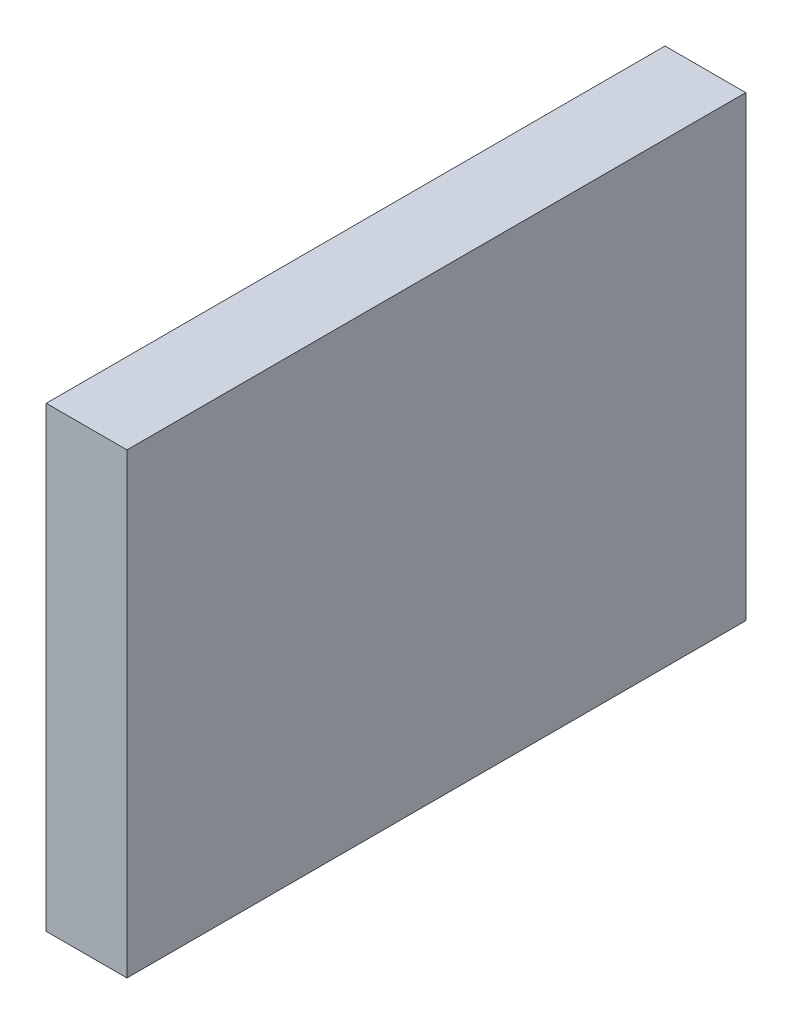
ISO-10303-21;
HEADER;
FILE_DESCRIPTION(('STEP AP214'),'2;1');
FILE_NAME('part.step','',(''),(''),'','','');
FILE_SCHEMA(('AUTOMOTIVE_DESIGN { 1 0 10303 214 1 1 1 1 }'));
ENDSEC;
DATA;
#1=APPLICATION_CONTEXT('core data for automotive mechanical design processes');
#2=APPLICATION_PROTOCOL_DEFINITION('international standard','automotive_design',2000,#1);
#3=PRODUCT_CONTEXT('',#1,'mechanical');
#4=PRODUCT('Part','Part','',(#3));
#5=PRODUCT_RELATED_PRODUCT_CATEGORY('part','',(#4));
#6=PRODUCT_DEFINITION_FORMATION('','',#4);
#7=PRODUCT_DEFINITION_CONTEXT('part definition',#1,'design');
#8=PRODUCT_DEFINITION('design','',#6,#7);
#9=PRODUCT_DEFINITION_SHAPE('','',#8);
#10=(LENGTH_UNIT() NAMED_UNIT(*) SI_UNIT(.MILLI.,.METRE.));
#11=(NAMED_UNIT(*) PLANE_ANGLE_UNIT() SI_UNIT($,.RADIAN.));
#12=(NAMED_UNIT(*) SI_UNIT($,.STERADIAN.) SOLID_ANGLE_UNIT());
#13=UNCERTAINTY_MEASURE_WITH_UNIT(LENGTH_MEASURE(1.E-05),#10,'distance_accuracy_value','');
#14=(GEOMETRIC_REPRESENTATION_CONTEXT(3) GLOBAL_UNCERTAINTY_ASSIGNED_CONTEXT((#13)) GLOBAL_UNIT_ASSIGNED_CONTEXT((#10,
#11,#12)) REPRESENTATION_CONTEXT('',''));
#15=CARTESIAN_POINT('',(0.,0.,0.));
#16=DIRECTION('',(0.,0.,1.));
#17=DIRECTION('',(1.,0.,0.));
#18=AXIS2_PLACEMENT_3D('',#15,#16,#17);
#19=CARTESIAN_POINT('',(-38.1,-215.9,584.2));
#20=DIRECTION('',(1.,0.,0.));
#21=DIRECTION('',(0.,0.,-1.));
#22=AXIS2_PLACEMENT_3D('',#19,#20,#21);
#23=PLANE('',#22);
#24=DIRECTION('',(0.,-1.,0.));
#25=VECTOR('',#24,1.);
#26=CARTESIAN_POINT('',(-38.1,-215.9,0.));
#27=LINE('',#26,#25);
#28=CARTESIAN_POINT('',(-38.1,215.9,0.));
#29=VERTEX_POINT('',#28);
#30=CARTESIAN_POINT('',(-38.1,-215.9,0.));
#31=VERTEX_POINT('',#30);
#32=EDGE_CURVE('E117',#29,#31,#27,.T.);
#33=ORIENTED_EDGE('',*,*,#32,.T.);
#34=DIRECTION('',(0.,0.,-1.));
#35=VECTOR('',#34,1.);
#36=CARTESIAN_POINT('',(-38.1,-215.9,584.2));
#37=LINE('',#36,#35);
#38=CARTESIAN_POINT('',(-38.1,-215.9,584.2));
#39=VERTEX_POINT('',#38);
#40=EDGE_CURVE('E11',#39,#31,#37,.T.);
#41=ORIENTED_EDGE('',*,*,#40,.F.);
#42=DIRECTION('',(0.,-1.,0.));
#43=VECTOR('',#42,1.);
#44=CARTESIAN_POINT('',(-38.1,-215.9,584.2));
#45=LINE('',#44,#43);
#46=CARTESIAN_POINT('',(-38.1,215.9,584.2));
#47=VERTEX_POINT('',#46);
#48=EDGE_CURVE('E101',#47,#39,#45,.T.);
#49=ORIENTED_EDGE('',*,*,#48,.F.);
#50=DIRECTION('',(0.,0.,-1.));
#51=VECTOR('',#50,1.);
#52=CARTESIAN_POINT('',(-38.1,215.9,584.2));
#53=LINE('',#52,#51);
#54=EDGE_CURVE('E113',#47,#29,#53,.T.);
#55=ORIENTED_EDGE('',*,*,#54,.T.);
#56=EDGE_LOOP('',(#33,#41,#49,#55));
#57=FACE_BOUND('',#56,.T.);
#58=ADVANCED_FACE('F49',(#57),#23,.F.);
#59=CARTESIAN_POINT('',(38.1,-215.9,584.2));
#60=DIRECTION('',(0.,1.,0.));
#61=DIRECTION('',(0.,0.,1.));
#62=AXIS2_PLACEMENT_3D('',#59,#60,#61);
#63=PLANE('',#62);
#64=DIRECTION('',(1.,0.,0.));
#65=VECTOR('',#64,1.);
#66=CARTESIAN_POINT('',(38.1,-215.9,0.));
#67=LINE('',#66,#65);
#68=CARTESIAN_POINT('',(38.1,-215.9,0.));
#69=VERTEX_POINT('',#68);
#70=EDGE_CURVE('E106',#31,#69,#67,.T.);
#71=ORIENTED_EDGE('',*,*,#70,.T.);
#72=DIRECTION('',(0.,0.,-1.));
#73=VECTOR('',#72,1.);
#74=CARTESIAN_POINT('',(38.1,-215.9,584.2));
#75=LINE('',#74,#73);
#76=CARTESIAN_POINT('',(38.1,-215.9,584.2));
#77=VERTEX_POINT('',#76);
#78=EDGE_CURVE('E58',#77,#69,#75,.T.);
#79=ORIENTED_EDGE('',*,*,#78,.F.);
#80=DIRECTION('',(1.,0.,0.));
#81=VECTOR('',#80,1.);
#82=CARTESIAN_POINT('',(38.1,-215.9,584.2));
#83=LINE('',#82,#81);
#84=EDGE_CURVE('E96',#39,#77,#83,.T.);
#85=ORIENTED_EDGE('',*,*,#84,.F.);
#86=ORIENTED_EDGE('',*,*,#40,.T.);
#87=EDGE_LOOP('',(#71,#79,#85,#86));
#88=FACE_BOUND('',#87,.T.);
#89=ADVANCED_FACE('F105',(#88),#63,.F.);
#90=CARTESIAN_POINT('',(38.1,-215.9,584.2));
#91=DIRECTION('',(-1.,0.,0.));
#92=DIRECTION('',(0.,0.,1.));
#93=AXIS2_PLACEMENT_3D('',#90,#91,#92);
#94=PLANE('',#93);
#95=DIRECTION('',(0.,1.,0.));
#96=VECTOR('',#95,1.);
#97=CARTESIAN_POINT('',(38.1,-215.9,0.));
#98=LINE('',#97,#96);
#99=CARTESIAN_POINT('',(38.1,215.9,0.));
#100=VERTEX_POINT('',#99);
#101=EDGE_CURVE('E83',#69,#100,#98,.T.);
#102=ORIENTED_EDGE('',*,*,#101,.T.);
#103=DIRECTION('',(0.,0.,-1.));
#104=VECTOR('',#103,1.);
#105=CARTESIAN_POINT('',(38.1,215.9,584.2));
#106=LINE('',#105,#104);
#107=CARTESIAN_POINT('',(38.1,215.9,584.2));
#108=VERTEX_POINT('',#107);
#109=EDGE_CURVE('E108',#108,#100,#106,.T.);
#110=ORIENTED_EDGE('',*,*,#109,.F.);
#111=DIRECTION('',(0.,1.,0.));
#112=VECTOR('',#111,1.);
#113=CARTESIAN_POINT('',(38.1,-215.9,584.2));
#114=LINE('',#113,#112);
#115=EDGE_CURVE('E99',#77,#108,#114,.T.);
#116=ORIENTED_EDGE('',*,*,#115,.F.);
#117=ORIENTED_EDGE('',*,*,#78,.T.);
#118=EDGE_LOOP('',(#102,#110,#116,#117));
#119=FACE_BOUND('',#118,.T.);
#120=ADVANCED_FACE('F109',(#119),#94,.F.);
#121=CARTESIAN_POINT('',(38.1,215.9,584.2));
#122=DIRECTION('',(0.,-1.,0.));
#123=DIRECTION('',(0.,0.,-1.));
#124=AXIS2_PLACEMENT_3D('',#121,#122,#123);
#125=PLANE('',#124);
#126=DIRECTION('',(-1.,0.,0.));
#127=VECTOR('',#126,1.);
#128=CARTESIAN_POINT('',(38.1,215.9,0.));
#129=LINE('',#128,#127);
#130=EDGE_CURVE('E89',#100,#29,#129,.T.);
#131=ORIENTED_EDGE('',*,*,#130,.T.);
#132=ORIENTED_EDGE('',*,*,#54,.F.);
#133=DIRECTION('',(-1.,0.,0.));
#134=VECTOR('',#133,1.);
#135=CARTESIAN_POINT('',(38.1,215.9,584.2));
#136=LINE('',#135,#134);
#137=EDGE_CURVE('E66',#108,#47,#136,.T.);
#138=ORIENTED_EDGE('',*,*,#137,.F.);
#139=ORIENTED_EDGE('',*,*,#109,.T.);
#140=EDGE_LOOP('',(#131,#132,#138,#139));
#141=FACE_BOUND('',#140,.T.);
#142=ADVANCED_FACE('F130',(#141),#125,.F.);
#143=CARTESIAN_POINT('',(0.,0.,584.2));
#144=DIRECTION('',(0.,0.,1.));
#145=DIRECTION('',(1.,0.,0.));
#146=AXIS2_PLACEMENT_3D('',#143,#144,#145);
#147=PLANE('',#146);
#148=ORIENTED_EDGE('',*,*,#48,.T.);
#149=ORIENTED_EDGE('',*,*,#84,.T.);
#150=ORIENTED_EDGE('',*,*,#115,.T.);
#151=ORIENTED_EDGE('',*,*,#137,.T.);
#152=EDGE_LOOP('',(#148,#149,#150,#151));
#153=FACE_BOUND('',#152,.T.);
#154=ADVANCED_FACE('F97',(#153),#147,.T.);
#155=CARTESIAN_POINT('',(0.,0.,0.));
#156=DIRECTION('',(0.,0.,1.));
#157=DIRECTION('',(1.,0.,0.));
#158=AXIS2_PLACEMENT_3D('',#155,#156,#157);
#159=PLANE('',#158);
#160=ORIENTED_EDGE('',*,*,#32,.F.);
#161=ORIENTED_EDGE('',*,*,#130,.F.);
#162=ORIENTED_EDGE('',*,*,#101,.F.);
#163=ORIENTED_EDGE('',*,*,#70,.F.);
#164=EDGE_LOOP('',(#160,#161,#162,#163));
#165=FACE_BOUND('',#164,.T.);
#166=ADVANCED_FACE('F133',(#165),#159,.F.);
#167=CLOSED_SHELL('',(#58,#89,#120,#142,#154,#166));
#168=MANIFOLD_SOLID_BREP('B2',#167);
#169=ADVANCED_BREP_SHAPE_REPRESENTATION('',(#18,#168),#14);
#170=SHAPE_DEFINITION_REPRESENTATION(#9,#169);
ENDSEC;
END-ISO-10303-21;
